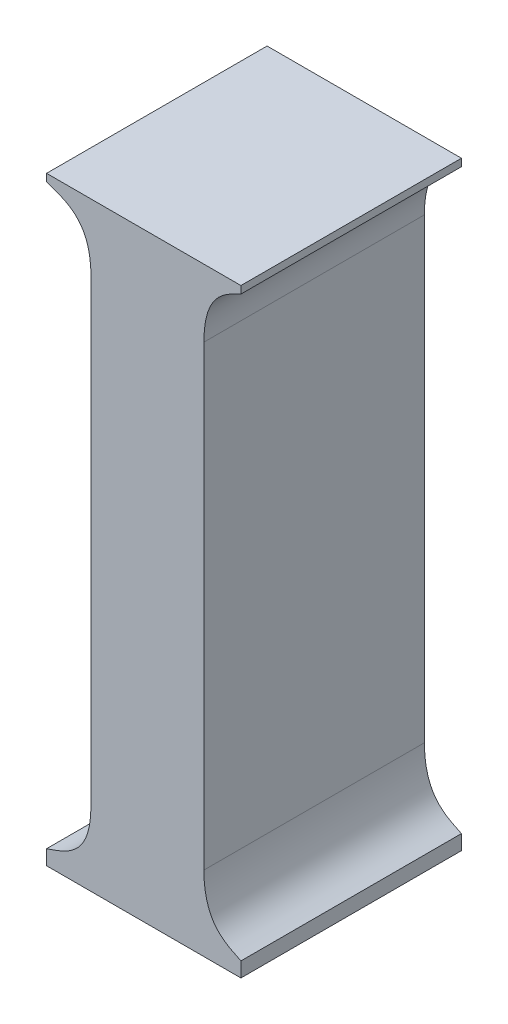
ISO-10303-21;
HEADER;
FILE_DESCRIPTION(('STEP AP214'),'2;1');
FILE_NAME('part.step','',(''),(''),'','','');
FILE_SCHEMA(('AUTOMOTIVE_DESIGN { 1 0 10303 214 1 1 1 1 }'));
ENDSEC;
DATA;
#1=APPLICATION_CONTEXT('core data for automotive mechanical design processes');
#2=APPLICATION_PROTOCOL_DEFINITION('international standard','automotive_design',2000,#1);
#3=PRODUCT_CONTEXT('',#1,'mechanical');
#4=PRODUCT('Part','Part','',(#3));
#5=PRODUCT_RELATED_PRODUCT_CATEGORY('part','',(#4));
#6=PRODUCT_DEFINITION_FORMATION('','',#4);
#7=PRODUCT_DEFINITION_CONTEXT('part definition',#1,'design');
#8=PRODUCT_DEFINITION('design','',#6,#7);
#9=PRODUCT_DEFINITION_SHAPE('','',#8);
#10=(LENGTH_UNIT() NAMED_UNIT(*) SI_UNIT(.MILLI.,.METRE.));
#11=(NAMED_UNIT(*) PLANE_ANGLE_UNIT() SI_UNIT($,.RADIAN.));
#12=(NAMED_UNIT(*) SI_UNIT($,.STERADIAN.) SOLID_ANGLE_UNIT());
#13=UNCERTAINTY_MEASURE_WITH_UNIT(LENGTH_MEASURE(1.E-05),#10,'distance_accuracy_value','');
#14=(GEOMETRIC_REPRESENTATION_CONTEXT(3) GLOBAL_UNCERTAINTY_ASSIGNED_CONTEXT((#13)) GLOBAL_UNIT_ASSIGNED_CONTEXT((#10,
#11,#12)) REPRESENTATION_CONTEXT('',''));
#15=CARTESIAN_POINT('',(0.,0.,0.));
#16=DIRECTION('',(0.,0.,1.));
#17=DIRECTION('',(1.,0.,0.));
#18=AXIS2_PLACEMENT_3D('',#15,#16,#17);
#19=CARTESIAN_POINT('',(0.828746298285,-0.188598290898415,0.));
#20=DIRECTION('',(-1.,0.,0.));
#21=DIRECTION('',(0.,-1.,0.));
#22=AXIS2_PLACEMENT_3D('',#19,#20,#21);
#23=PLANE('',#22);
#24=DIRECTION('',(0.,1.,0.));
#25=VECTOR('',#24,1.);
#26=CARTESIAN_POINT('',(0.828746298285,-0.191955959643483,0.));
#27=LINE('',#26,#25);
#28=CARTESIAN_POINT('',(0.828746298285,-0.191955959643483,0.));
#29=VERTEX_POINT('',#28);
#30=CARTESIAN_POINT('',(0.828746298285,-0.188598290898415,0.));
#31=VERTEX_POINT('',#30);
#32=EDGE_CURVE('E11',#29,#31,#27,.T.);
#33=ORIENTED_EDGE('',*,*,#32,.F.);
#34=DIRECTION('',(0.,0.,1.));
#35=VECTOR('',#34,1.);
#36=CARTESIAN_POINT('',(0.828746298285,-0.191955959643483,0.));
#37=LINE('',#36,#35);
#38=CARTESIAN_POINT('',(0.828746298285,-0.191955959643483,0.1));
#39=VERTEX_POINT('',#38);
#40=EDGE_CURVE('E24',#29,#39,#37,.T.);
#41=ORIENTED_EDGE('',*,*,#40,.T.);
#42=DIRECTION('',(0.,-1.,0.));
#43=VECTOR('',#42,1.);
#44=CARTESIAN_POINT('',(0.828746298285,-0.191955959643483,0.1));
#45=LINE('',#44,#43);
#46=CARTESIAN_POINT('',(0.828746298285,-0.188598290898415,0.1));
#47=VERTEX_POINT('',#46);
#48=EDGE_CURVE('E124',#47,#39,#45,.T.);
#49=ORIENTED_EDGE('',*,*,#48,.F.);
#50=DIRECTION('',(0.,0.,1.));
#51=VECTOR('',#50,1.);
#52=CARTESIAN_POINT('',(0.828746298285,-0.188598290898415,0.));
#53=LINE('',#52,#51);
#54=EDGE_CURVE('E237',#31,#47,#53,.T.);
#55=ORIENTED_EDGE('',*,*,#54,.F.);
#56=EDGE_LOOP('',(#33,#41,#49,#55));
#57=FACE_BOUND('',#56,.T.);
#58=ADVANCED_FACE('F17',(#57),#23,.T.);
#59=CARTESIAN_POINT('',(0.916886194656,-0.188598290898415,0.));
#60=DIRECTION('',(0.,1.,0.));
#61=DIRECTION('',(-1.,0.,0.));
#62=AXIS2_PLACEMENT_3D('',#59,#60,#61);
#63=PLANE('',#62);
#64=DIRECTION('',(1.,0.,0.));
#65=VECTOR('',#64,1.);
#66=CARTESIAN_POINT('',(0.828746298285,-0.188598290898415,0.));
#67=LINE('',#66,#65);
#68=CARTESIAN_POINT('',(0.916886194656,-0.188598290898415,0.));
#69=VERTEX_POINT('',#68);
#70=EDGE_CURVE('E235',#31,#69,#67,.T.);
#71=ORIENTED_EDGE('',*,*,#70,.F.);
#72=ORIENTED_EDGE('',*,*,#54,.T.);
#73=DIRECTION('',(-1.,0.,0.));
#74=VECTOR('',#73,1.);
#75=CARTESIAN_POINT('',(0.828746298285,-0.188598290898415,0.1));
#76=LINE('',#75,#74);
#77=CARTESIAN_POINT('',(0.916886194656,-0.188598290898415,0.1));
#78=VERTEX_POINT('',#77);
#79=EDGE_CURVE('E233',#78,#47,#76,.T.);
#80=ORIENTED_EDGE('',*,*,#79,.F.);
#81=DIRECTION('',(0.,0.,1.));
#82=VECTOR('',#81,1.);
#83=CARTESIAN_POINT('',(0.916886194656,-0.188598290898415,0.));
#84=LINE('',#83,#82);
#85=EDGE_CURVE('E230',#69,#78,#84,.T.);
#86=ORIENTED_EDGE('',*,*,#85,.F.);
#87=EDGE_LOOP('',(#71,#72,#80,#86));
#88=FACE_BOUND('',#87,.T.);
#89=ADVANCED_FACE('F275',(#88),#63,.T.);
#90=CARTESIAN_POINT('',(0.916886194656,-0.191955959643483,0.));
#91=DIRECTION('',(1.,0.,0.));
#92=DIRECTION('',(0.,1.,0.));
#93=AXIS2_PLACEMENT_3D('',#90,#91,#92);
#94=PLANE('',#93);
#95=DIRECTION('',(0.,-1.,0.));
#96=VECTOR('',#95,1.);
#97=CARTESIAN_POINT('',(0.916886194656,-0.188598290898415,0.));
#98=LINE('',#97,#96);
#99=CARTESIAN_POINT('',(0.916886194656,-0.191955959643483,0.));
#100=VERTEX_POINT('',#99);
#101=EDGE_CURVE('E228',#69,#100,#98,.T.);
#102=ORIENTED_EDGE('',*,*,#101,.F.);
#103=ORIENTED_EDGE('',*,*,#85,.T.);
#104=DIRECTION('',(0.,1.,0.));
#105=VECTOR('',#104,1.);
#106=CARTESIAN_POINT('',(0.916886194656,-0.188598290898415,0.1));
#107=LINE('',#106,#105);
#108=CARTESIAN_POINT('',(0.916886194656,-0.191955959643483,0.1));
#109=VERTEX_POINT('',#108);
#110=EDGE_CURVE('E225',#109,#78,#107,.T.);
#111=ORIENTED_EDGE('',*,*,#110,.F.);
#112=DIRECTION('',(0.,0.,1.));
#113=VECTOR('',#112,1.);
#114=CARTESIAN_POINT('',(0.916886194656,-0.191955959643483,0.));
#115=LINE('',#114,#113);
#116=EDGE_CURVE('E219',#100,#109,#115,.T.);
#117=ORIENTED_EDGE('',*,*,#116,.F.);
#118=EDGE_LOOP('',(#102,#103,#111,#117));
#119=FACE_BOUND('',#118,.T.);
#120=ADVANCED_FACE('F271',(#119),#94,.T.);
#121=CARTESIAN_POINT('',(0.900097227037,-0.2192375017145,0.));
#122=CARTESIAN_POINT('',(0.900097227037,-0.2192375017145,0.1));
#123=CARTESIAN_POINT('',(0.900097227037001,-0.19867145310695,0.));
#124=CARTESIAN_POINT('',(0.900097227037001,-0.19867145310695,0.1));
#125=CARTESIAN_POINT('',(0.910170919555001,-0.195313628388565,0.));
#126=CARTESIAN_POINT('',(0.910170919555001,-0.195313628388565,0.1));
#127=CARTESIAN_POINT('',(0.916886194656,-0.191955959643483,0.));
#128=CARTESIAN_POINT('',(0.916886194656,-0.191955959643483,0.1));
#129=B_SPLINE_SURFACE_WITH_KNOTS('',3,1,((#121,#122),(#123,#124),(#125,#126),(#127,#128)),
.UNSPECIFIED.,.F.,.F.,.F.,(4,4),(2,2),(-1.,0.),(0.,0.01),.UNSPECIFIED.);
#130=CARTESIAN_POINT('',(0.916886194656,-0.191955959643483,0.));
#131=CARTESIAN_POINT('',(0.910170919555001,-0.195313628388565,0.));
#132=CARTESIAN_POINT('',(0.900097227037001,-0.19867145310695,0.));
#133=CARTESIAN_POINT('',(0.900097227037,-0.2192375017145,0.));
#134=B_SPLINE_CURVE_WITH_KNOTS('',3,(#130,#131,#132,#133),.UNSPECIFIED.,.F.,.F.,(4,4),(0.,1.),.UNSPECIFIED.);
#135=CARTESIAN_POINT('',(0.900097227037,-0.2192375017145,0.));
#136=VERTEX_POINT('',#135);
#137=EDGE_CURVE('E212',#100,#136,#134,.T.);
#138=CARTESIAN_POINT('',(0.900097227037,-0.2192375017145,0.1));
#139=CARTESIAN_POINT('',(0.900097227037001,-0.19867145310695,0.1));
#140=CARTESIAN_POINT('',(0.910170919555001,-0.195313628388565,0.1));
#141=CARTESIAN_POINT('',(0.916886194656,-0.191955959643483,0.1));
#142=B_SPLINE_CURVE_WITH_KNOTS('',3,(#138,#139,#140,#141),.UNSPECIFIED.,.F.,.F.,(4,4),(-1.,0.),.UNSPECIFIED.);
#143=CARTESIAN_POINT('',(0.900097227037,-0.2192375017145,0.1));
#144=VERTEX_POINT('',#143);
#145=EDGE_CURVE('E207',#144,#109,#142,.T.);
#146=DIRECTION('',(0.,0.,1.));
#147=VECTOR('',#146,1.);
#148=CARTESIAN_POINT('',(0.900097227037,-0.2192375017145,0.));
#149=LINE('',#148,#147);
#150=EDGE_CURVE('E204',#136,#144,#149,.T.);
#151=ORIENTED_EDGE('',*,*,#137,.F.);
#152=ORIENTED_EDGE('',*,*,#116,.T.);
#153=ORIENTED_EDGE('',*,*,#145,.F.);
#154=ORIENTED_EDGE('',*,*,#150,.F.);
#155=EDGE_LOOP('',(#151,#152,#153,#154));
#156=FACE_BOUND('',#155,.T.);
#157=ADVANCED_FACE('F267',(#156),#129,.T.);
#158=CARTESIAN_POINT('',(0.900097227037,-0.426577508445,0.));
#159=DIRECTION('',(1.,0.,0.));
#160=DIRECTION('',(0.,1.,0.));
#161=AXIS2_PLACEMENT_3D('',#158,#159,#160);
#162=PLANE('',#161);
#163=DIRECTION('',(0.,-1.,0.));
#164=VECTOR('',#163,1.);
#165=CARTESIAN_POINT('',(0.900097227037,-0.2192375017145,0.));
#166=LINE('',#165,#164);
#167=CARTESIAN_POINT('',(0.900097227037,-0.426577508445,0.));
#168=VERTEX_POINT('',#167);
#169=EDGE_CURVE('E202',#136,#168,#166,.T.);
#170=ORIENTED_EDGE('',*,*,#169,.F.);
#171=ORIENTED_EDGE('',*,*,#150,.T.);
#172=DIRECTION('',(0.,1.,0.));
#173=VECTOR('',#172,1.);
#174=CARTESIAN_POINT('',(0.900097227037,-0.2192375017145,0.1));
#175=LINE('',#174,#173);
#176=CARTESIAN_POINT('',(0.900097227037,-0.426577508445,0.1));
#177=VERTEX_POINT('',#176);
#178=EDGE_CURVE('E199',#177,#144,#175,.T.);
#179=ORIENTED_EDGE('',*,*,#178,.F.);
#180=DIRECTION('',(0.,0.,1.));
#181=VECTOR('',#180,1.);
#182=CARTESIAN_POINT('',(0.900097227037,-0.426577508445,0.));
#183=LINE('',#182,#181);
#184=EDGE_CURVE('E193',#168,#177,#183,.T.);
#185=ORIENTED_EDGE('',*,*,#184,.F.);
#186=EDGE_LOOP('',(#170,#171,#179,#185));
#187=FACE_BOUND('',#186,.T.);
#188=ADVANCED_FACE('F263',(#187),#162,.T.);
#189=CARTESIAN_POINT('',(0.916886194656,-0.453859050516,0.));
#190=CARTESIAN_POINT('',(0.916886194656,-0.453859050516,0.1));
#191=CARTESIAN_POINT('',(0.910170919555,-0.450501256992,0.));
#192=CARTESIAN_POINT('',(0.910170919555,-0.450501256992,0.1));
#193=CARTESIAN_POINT('',(0.900097227037,-0.447143557053,0.));
#194=CARTESIAN_POINT('',(0.900097227037,-0.447143557053,0.1));
#195=CARTESIAN_POINT('',(0.900097227037,-0.426577508445,0.));
#196=CARTESIAN_POINT('',(0.900097227037,-0.426577508445,0.1));
#197=B_SPLINE_SURFACE_WITH_KNOTS('',3,1,((#189,#190),(#191,#192),(#193,#194),(#195,#196)),
.UNSPECIFIED.,.F.,.F.,.F.,(4,4),(2,2),(-1.,0.),(0.,0.01),.UNSPECIFIED.);
#198=CARTESIAN_POINT('',(0.900097227037,-0.426577508445,0.));
#199=CARTESIAN_POINT('',(0.900097227037,-0.447143557053,0.));
#200=CARTESIAN_POINT('',(0.910170919555,-0.450501256992,0.));
#201=CARTESIAN_POINT('',(0.916886194656,-0.453859050516,0.));
#202=B_SPLINE_CURVE_WITH_KNOTS('',3,(#198,#199,#200,#201),.UNSPECIFIED.,.F.,.F.,(4,4),(0.,1.),.UNSPECIFIED.);
#203=CARTESIAN_POINT('',(0.916886194656,-0.453859050516,0.));
#204=VERTEX_POINT('',#203);
#205=EDGE_CURVE('E186',#168,#204,#202,.T.);
#206=CARTESIAN_POINT('',(0.916886194656,-0.453859050516,0.1));
#207=CARTESIAN_POINT('',(0.910170919555,-0.450501256992,0.1));
#208=CARTESIAN_POINT('',(0.900097227037,-0.447143557053,0.1));
#209=CARTESIAN_POINT('',(0.900097227037,-0.426577508445,0.1));
#210=B_SPLINE_CURVE_WITH_KNOTS('',3,(#206,#207,#208,#209),.UNSPECIFIED.,.F.,.F.,(4,4),(-1.,0.),.UNSPECIFIED.);
#211=CARTESIAN_POINT('',(0.916886194656,-0.453859050516,0.1));
#212=VERTEX_POINT('',#211);
#213=EDGE_CURVE('E181',#212,#177,#210,.T.);
#214=DIRECTION('',(0.,0.,1.));
#215=VECTOR('',#214,1.);
#216=CARTESIAN_POINT('',(0.916886194656,-0.453859050516,0.));
#217=LINE('',#216,#215);
#218=EDGE_CURVE('E178',#204,#212,#217,.T.);
#219=ORIENTED_EDGE('',*,*,#205,.F.);
#220=ORIENTED_EDGE('',*,*,#184,.T.);
#221=ORIENTED_EDGE('',*,*,#213,.F.);
#222=ORIENTED_EDGE('',*,*,#218,.F.);
#223=EDGE_LOOP('',(#219,#220,#221,#222));
#224=FACE_BOUND('',#223,.T.);
#225=ADVANCED_FACE('F259',(#224),#197,.T.);
#226=CARTESIAN_POINT('',(0.916886194656,-0.46057454398,0.));
#227=DIRECTION('',(1.,0.,0.));
#228=DIRECTION('',(0.,1.,0.));
#229=AXIS2_PLACEMENT_3D('',#226,#227,#228);
#230=PLANE('',#229);
#231=DIRECTION('',(0.,-1.,0.));
#232=VECTOR('',#231,1.);
#233=CARTESIAN_POINT('',(0.916886194656,-0.453859050516,0.));
#234=LINE('',#233,#232);
#235=CARTESIAN_POINT('',(0.916886194656,-0.46057454398,0.));
#236=VERTEX_POINT('',#235);
#237=EDGE_CURVE('E176',#204,#236,#234,.T.);
#238=ORIENTED_EDGE('',*,*,#237,.F.);
#239=ORIENTED_EDGE('',*,*,#218,.T.);
#240=DIRECTION('',(0.,1.,0.));
#241=VECTOR('',#240,1.);
#242=CARTESIAN_POINT('',(0.916886194656,-0.453859050516,0.1));
#243=LINE('',#242,#241);
#244=CARTESIAN_POINT('',(0.916886194656,-0.46057454398,0.1));
#245=VERTEX_POINT('',#244);
#246=EDGE_CURVE('E173',#245,#212,#243,.T.);
#247=ORIENTED_EDGE('',*,*,#246,.F.);
#248=DIRECTION('',(0.,0.,1.));
#249=VECTOR('',#248,1.);
#250=CARTESIAN_POINT('',(0.916886194656,-0.46057454398,0.));
#251=LINE('',#250,#249);
#252=EDGE_CURVE('E170',#236,#245,#251,.T.);
#253=ORIENTED_EDGE('',*,*,#252,.F.);
#254=EDGE_LOOP('',(#238,#239,#247,#253));
#255=FACE_BOUND('',#254,.T.);
#256=ADVANCED_FACE('F255',(#255),#230,.T.);
#257=CARTESIAN_POINT('',(0.828746298285,-0.46057454398,0.));
#258=DIRECTION('',(0.,-1.,0.));
#259=DIRECTION('',(1.,0.,0.));
#260=AXIS2_PLACEMENT_3D('',#257,#258,#259);
#261=PLANE('',#260);
#262=DIRECTION('',(-1.,0.,0.));
#263=VECTOR('',#262,1.);
#264=CARTESIAN_POINT('',(0.916886194656,-0.46057454398,0.));
#265=LINE('',#264,#263);
#266=CARTESIAN_POINT('',(0.828746298285,-0.46057454398,0.));
#267=VERTEX_POINT('',#266);
#268=EDGE_CURVE('E168',#236,#267,#265,.T.);
#269=ORIENTED_EDGE('',*,*,#268,.F.);
#270=ORIENTED_EDGE('',*,*,#252,.T.);
#271=DIRECTION('',(1.,0.,0.));
#272=VECTOR('',#271,1.);
#273=CARTESIAN_POINT('',(0.916886194656,-0.46057454398,0.1));
#274=LINE('',#273,#272);
#275=CARTESIAN_POINT('',(0.828746298285,-0.46057454398,0.1));
#276=VERTEX_POINT('',#275);
#277=EDGE_CURVE('E165',#276,#245,#274,.T.);
#278=ORIENTED_EDGE('',*,*,#277,.F.);
#279=DIRECTION('',(0.,0.,1.));
#280=VECTOR('',#279,1.);
#281=CARTESIAN_POINT('',(0.828746298285,-0.46057454398,0.));
#282=LINE('',#281,#280);
#283=EDGE_CURVE('E162',#267,#276,#282,.T.);
#284=ORIENTED_EDGE('',*,*,#283,.F.);
#285=EDGE_LOOP('',(#269,#270,#278,#284));
#286=FACE_BOUND('',#285,.T.);
#287=ADVANCED_FACE('F251',(#286),#261,.T.);
#288=CARTESIAN_POINT('',(0.828746298285,-0.453859050516,0.));
#289=DIRECTION('',(-1.,0.,0.));
#290=DIRECTION('',(0.,-1.,0.));
#291=AXIS2_PLACEMENT_3D('',#288,#289,#290);
#292=PLANE('',#291);
#293=DIRECTION('',(0.,1.,0.));
#294=VECTOR('',#293,1.);
#295=CARTESIAN_POINT('',(0.828746298285,-0.46057454398,0.));
#296=LINE('',#295,#294);
#297=CARTESIAN_POINT('',(0.828746298285,-0.453859050516,0.));
#298=VERTEX_POINT('',#297);
#299=EDGE_CURVE('E160',#267,#298,#296,.T.);
#300=ORIENTED_EDGE('',*,*,#299,.F.);
#301=ORIENTED_EDGE('',*,*,#283,.T.);
#302=DIRECTION('',(0.,-1.,0.));
#303=VECTOR('',#302,1.);
#304=CARTESIAN_POINT('',(0.828746298285,-0.46057454398,0.1));
#305=LINE('',#304,#303);
#306=CARTESIAN_POINT('',(0.828746298285,-0.453859050516,0.1));
#307=VERTEX_POINT('',#306);
#308=EDGE_CURVE('E157',#307,#276,#305,.T.);
#309=ORIENTED_EDGE('',*,*,#308,.F.);
#310=DIRECTION('',(0.,0.,1.));
#311=VECTOR('',#310,1.);
#312=CARTESIAN_POINT('',(0.828746298285,-0.453859050516,0.));
#313=LINE('',#312,#311);
#314=EDGE_CURVE('E151',#298,#307,#313,.T.);
#315=ORIENTED_EDGE('',*,*,#314,.F.);
#316=EDGE_LOOP('',(#300,#301,#309,#315));
#317=FACE_BOUND('',#316,.T.);
#318=ADVANCED_FACE('F247',(#317),#292,.T.);
#319=CARTESIAN_POINT('',(0.848892435534,-0.426577508445,0.));
#320=CARTESIAN_POINT('',(0.848892435534,-0.426577508445,0.1));
#321=CARTESIAN_POINT('',(0.848892435534,-0.447143557053,0.));
#322=CARTESIAN_POINT('',(0.848892435534,-0.447143557053,0.1));
#323=CARTESIAN_POINT('',(0.838818743016,-0.450501256992,0.));
#324=CARTESIAN_POINT('',(0.838818743016,-0.450501256992,0.1));
#325=CARTESIAN_POINT('',(0.828746298285,-0.453859050516,0.));
#326=CARTESIAN_POINT('',(0.828746298285,-0.453859050516,0.1));
#327=B_SPLINE_SURFACE_WITH_KNOTS('',3,1,((#319,#320),(#321,#322),(#323,#324),(#325,#326)),
.UNSPECIFIED.,.F.,.F.,.F.,(4,4),(2,2),(-1.,0.),(0.,0.01),.UNSPECIFIED.);
#328=CARTESIAN_POINT('',(0.828746298285,-0.453859050516,0.));
#329=CARTESIAN_POINT('',(0.838818743016,-0.450501256992,0.));
#330=CARTESIAN_POINT('',(0.848892435534,-0.447143557053,0.));
#331=CARTESIAN_POINT('',(0.848892435534,-0.426577508445,0.));
#332=B_SPLINE_CURVE_WITH_KNOTS('',3,(#328,#329,#330,#331),.UNSPECIFIED.,.F.,.F.,(4,4),(0.,1.),.UNSPECIFIED.);
#333=CARTESIAN_POINT('',(0.848892435534,-0.426577508445,0.));
#334=VERTEX_POINT('',#333);
#335=EDGE_CURVE('E144',#298,#334,#332,.T.);
#336=CARTESIAN_POINT('',(0.848892435534,-0.426577508445,0.1));
#337=CARTESIAN_POINT('',(0.848892435534,-0.447143557053,0.1));
#338=CARTESIAN_POINT('',(0.838818743016,-0.450501256992,0.1));
#339=CARTESIAN_POINT('',(0.828746298285,-0.453859050516,0.1));
#340=B_SPLINE_CURVE_WITH_KNOTS('',3,(#336,#337,#338,#339),.UNSPECIFIED.,.F.,.F.,(4,4),(-1.,0.),.UNSPECIFIED.);
#341=CARTESIAN_POINT('',(0.848892435534,-0.426577508445,0.1));
#342=VERTEX_POINT('',#341);
#343=EDGE_CURVE('E140',#342,#307,#340,.T.);
#344=DIRECTION('',(0.,0.,1.));
#345=VECTOR('',#344,1.);
#346=CARTESIAN_POINT('',(0.848892435534,-0.426577508445,0.));
#347=LINE('',#346,#345);
#348=EDGE_CURVE('E109',#334,#342,#347,.T.);
#349=ORIENTED_EDGE('',*,*,#335,.F.);
#350=ORIENTED_EDGE('',*,*,#314,.T.);
#351=ORIENTED_EDGE('',*,*,#343,.F.);
#352=ORIENTED_EDGE('',*,*,#348,.F.);
#353=EDGE_LOOP('',(#349,#350,#351,#352));
#354=FACE_BOUND('',#353,.T.);
#355=ADVANCED_FACE('F245',(#354),#327,.T.);
#356=CARTESIAN_POINT('',(0.848892435534,-0.2192375017145,0.));
#357=DIRECTION('',(-1.,0.,0.));
#358=DIRECTION('',(0.,-1.,0.));
#359=AXIS2_PLACEMENT_3D('',#356,#357,#358);
#360=PLANE('',#359);
#361=DIRECTION('',(0.,1.,0.));
#362=VECTOR('',#361,1.);
#363=CARTESIAN_POINT('',(0.848892435534,-0.426577508445,0.));
#364=LINE('',#363,#362);
#365=CARTESIAN_POINT('',(0.848892435534,-0.2192375017145,0.));
#366=VERTEX_POINT('',#365);
#367=EDGE_CURVE('E113',#334,#366,#364,.T.);
#368=ORIENTED_EDGE('',*,*,#367,.F.);
#369=ORIENTED_EDGE('',*,*,#348,.T.);
#370=DIRECTION('',(0.,-1.,0.));
#371=VECTOR('',#370,1.);
#372=CARTESIAN_POINT('',(0.848892435534,-0.426577508445,0.1));
#373=LINE('',#372,#371);
#374=CARTESIAN_POINT('',(0.848892435534,-0.2192375017145,0.1));
#375=VERTEX_POINT('',#374);
#376=EDGE_CURVE('E102',#375,#342,#373,.T.);
#377=ORIENTED_EDGE('',*,*,#376,.F.);
#378=DIRECTION('',(0.,0.,1.));
#379=VECTOR('',#378,1.);
#380=CARTESIAN_POINT('',(0.848892435534,-0.2192375017145,0.));
#381=LINE('',#380,#379);
#382=EDGE_CURVE('E106',#366,#375,#381,.T.);
#383=ORIENTED_EDGE('',*,*,#382,.F.);
#384=EDGE_LOOP('',(#368,#369,#377,#383));
#385=FACE_BOUND('',#384,.T.);
#386=ADVANCED_FACE('F105',(#385),#360,.T.);
#387=CARTESIAN_POINT('',(0.828746298285,-0.191955959643483,0.));
#388=CARTESIAN_POINT('',(0.828746298285,-0.191955959643483,0.1));
#389=CARTESIAN_POINT('',(0.838818743016,-0.195313628388565,0.));
#390=CARTESIAN_POINT('',(0.838818743016,-0.195313628388565,0.1));
#391=CARTESIAN_POINT('',(0.848892435534001,-0.19867145310695,0.));
#392=CARTESIAN_POINT('',(0.848892435534001,-0.19867145310695,0.1));
#393=CARTESIAN_POINT('',(0.848892435534,-0.2192375017145,0.));
#394=CARTESIAN_POINT('',(0.848892435534,-0.2192375017145,0.1));
#395=B_SPLINE_SURFACE_WITH_KNOTS('',3,1,((#387,#388),(#389,#390),(#391,#392),(#393,#394)),
.UNSPECIFIED.,.F.,.F.,.F.,(4,4),(2,2),(-1.,0.),(0.,0.01),.UNSPECIFIED.);
#396=CARTESIAN_POINT('',(0.848892435534,-0.2192375017145,0.));
#397=CARTESIAN_POINT('',(0.848892435534001,-0.19867145310695,0.));
#398=CARTESIAN_POINT('',(0.838818743016,-0.195313628388565,0.));
#399=CARTESIAN_POINT('',(0.828746298285,-0.191955959643483,0.));
#400=B_SPLINE_CURVE_WITH_KNOTS('',3,(#396,#397,#398,#399),.UNSPECIFIED.,.F.,.F.,(4,4),(0.,1.),.UNSPECIFIED.);
#401=EDGE_CURVE('E119',#366,#29,#400,.T.);
#402=CARTESIAN_POINT('',(0.828746298285,-0.191955959643483,0.1));
#403=CARTESIAN_POINT('',(0.838818743016,-0.195313628388565,0.1));
#404=CARTESIAN_POINT('',(0.848892435534001,-0.19867145310695,0.1));
#405=CARTESIAN_POINT('',(0.848892435534,-0.2192375017145,0.1));
#406=B_SPLINE_CURVE_WITH_KNOTS('',3,(#402,#403,#404,#405),.UNSPECIFIED.,.F.,.F.,(4,4),(-1.,0.),.UNSPECIFIED.);
#407=EDGE_CURVE('E118',#39,#375,#406,.T.);
#408=ORIENTED_EDGE('',*,*,#401,.F.);
#409=ORIENTED_EDGE('',*,*,#382,.T.);
#410=ORIENTED_EDGE('',*,*,#407,.F.);
#411=ORIENTED_EDGE('',*,*,#40,.F.);
#412=EDGE_LOOP('',(#408,#409,#410,#411));
#413=FACE_BOUND('',#412,.T.);
#414=ADVANCED_FACE('F117',(#413),#395,.T.);
#415=CARTESIAN_POINT('',(0.873760263178502,-0.324589260631028,0.));
#416=DIRECTION('',(0.,0.,1.));
#417=DIRECTION('',(1.,0.,0.));
#418=AXIS2_PLACEMENT_3D('',#415,#416,#417);
#419=PLANE('',#418);
#420=ORIENTED_EDGE('',*,*,#401,.T.);
#421=ORIENTED_EDGE('',*,*,#32,.T.);
#422=ORIENTED_EDGE('',*,*,#70,.T.);
#423=ORIENTED_EDGE('',*,*,#101,.T.);
#424=ORIENTED_EDGE('',*,*,#137,.T.);
#425=ORIENTED_EDGE('',*,*,#169,.T.);
#426=ORIENTED_EDGE('',*,*,#205,.T.);
#427=ORIENTED_EDGE('',*,*,#237,.T.);
#428=ORIENTED_EDGE('',*,*,#268,.T.);
#429=ORIENTED_EDGE('',*,*,#299,.T.);
#430=ORIENTED_EDGE('',*,*,#335,.T.);
#431=ORIENTED_EDGE('',*,*,#367,.T.);
#432=EDGE_LOOP('',(#420,#421,#422,#423,#424,#425,#426,#427,#428,#429,#430,#431));
#433=FACE_BOUND('',#432,.T.);
#434=ADVANCED_FACE('F240',(#433),#419,.F.);
#435=CARTESIAN_POINT('',(0.873760263178502,-0.324589260631028,0.1));
#436=DIRECTION('',(0.,0.,1.));
#437=DIRECTION('',(1.,0.,0.));
#438=AXIS2_PLACEMENT_3D('',#435,#436,#437);
#439=PLANE('',#438);
#440=ORIENTED_EDGE('',*,*,#407,.T.);
#441=ORIENTED_EDGE('',*,*,#376,.T.);
#442=ORIENTED_EDGE('',*,*,#343,.T.);
#443=ORIENTED_EDGE('',*,*,#308,.T.);
#444=ORIENTED_EDGE('',*,*,#277,.T.);
#445=ORIENTED_EDGE('',*,*,#246,.T.);
#446=ORIENTED_EDGE('',*,*,#213,.T.);
#447=ORIENTED_EDGE('',*,*,#178,.T.);
#448=ORIENTED_EDGE('',*,*,#145,.T.);
#449=ORIENTED_EDGE('',*,*,#110,.T.);
#450=ORIENTED_EDGE('',*,*,#79,.T.);
#451=ORIENTED_EDGE('',*,*,#48,.T.);
#452=EDGE_LOOP('',(#440,#441,#442,#443,#444,#445,#446,#447,#448,#449,#450,#451));
#453=FACE_BOUND('',#452,.T.);
#454=ADVANCED_FACE('F122',(#453),#439,.T.);
#455=CLOSED_SHELL('',(#58,#89,#120,#157,#188,#225,#256,#287,#318,#355,#386,#414,#434,#454));
#456=MANIFOLD_SOLID_BREP('B1',#455);
#457=ADVANCED_BREP_SHAPE_REPRESENTATION('',(#18,#456),#14);
#458=SHAPE_DEFINITION_REPRESENTATION(#9,#457);
ENDSEC;
END-ISO-10303-21;
